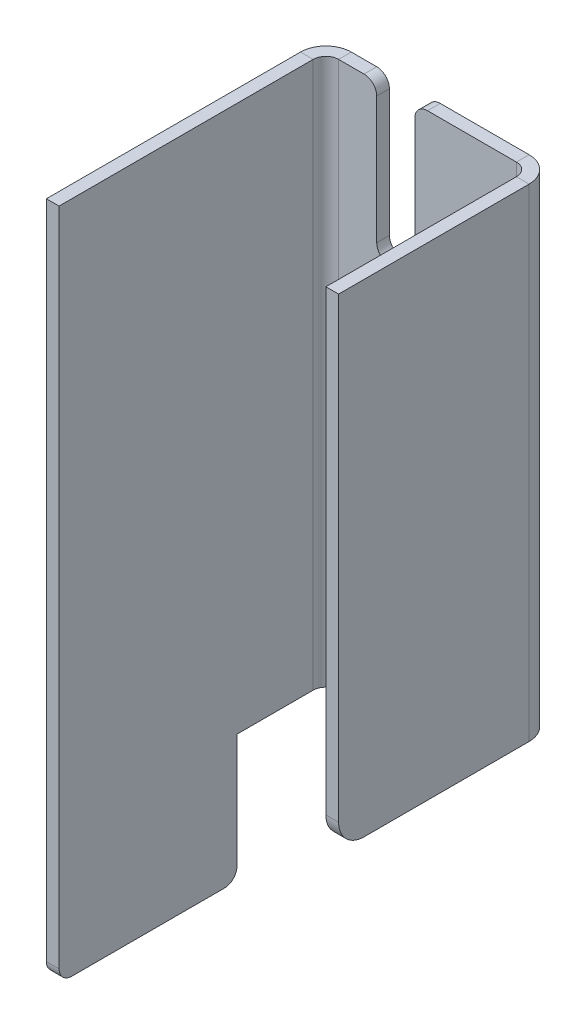
ISO-10303-21;
HEADER;
FILE_DESCRIPTION(('STEP AP214'),'2;1');
FILE_NAME('part.step','',(''),(''),'','','');
FILE_SCHEMA(('AUTOMOTIVE_DESIGN { 1 0 10303 214 1 1 1 1 }'));
ENDSEC;
DATA;
#1=APPLICATION_CONTEXT('core data for automotive mechanical design processes');
#2=APPLICATION_PROTOCOL_DEFINITION('international standard','automotive_design',2000,#1);
#3=PRODUCT_CONTEXT('',#1,'mechanical');
#4=PRODUCT('Part','Part','',(#3));
#5=PRODUCT_RELATED_PRODUCT_CATEGORY('part','',(#4));
#6=PRODUCT_DEFINITION_FORMATION('','',#4);
#7=PRODUCT_DEFINITION_CONTEXT('part definition',#1,'design');
#8=PRODUCT_DEFINITION('design','',#6,#7);
#9=PRODUCT_DEFINITION_SHAPE('','',#8);
#10=(LENGTH_UNIT() NAMED_UNIT(*) SI_UNIT(.MILLI.,.METRE.));
#11=(NAMED_UNIT(*) PLANE_ANGLE_UNIT() SI_UNIT($,.RADIAN.));
#12=(NAMED_UNIT(*) SI_UNIT($,.STERADIAN.) SOLID_ANGLE_UNIT());
#13=UNCERTAINTY_MEASURE_WITH_UNIT(LENGTH_MEASURE(1.E-05),#10,'distance_accuracy_value','');
#14=(GEOMETRIC_REPRESENTATION_CONTEXT(3) GLOBAL_UNCERTAINTY_ASSIGNED_CONTEXT((#13)) GLOBAL_UNIT_ASSIGNED_CONTEXT((#10,
#11,#12)) REPRESENTATION_CONTEXT('',''));
#15=CARTESIAN_POINT('',(0.,0.,0.));
#16=DIRECTION('',(0.,0.,1.));
#17=DIRECTION('',(1.,0.,0.));
#18=AXIS2_PLACEMENT_3D('',#15,#16,#17);
#19=CARTESIAN_POINT('',(6.,5.,-7.));
#20=DIRECTION('',(0.,1.,0.));
#21=DIRECTION('',(0.,0.,1.));
#22=AXIS2_PLACEMENT_3D('',#19,#20,#21);
#23=PLANE('',#22);
#24=DIRECTION('',(0.,0.,1.));
#25=VECTOR('',#24,1.);
#26=CARTESIAN_POINT('',(17.,5.,-22.));
#27=LINE('',#26,#25);
#28=CARTESIAN_POINT('',(17.,5.,-20.));
#29=VERTEX_POINT('',#28);
#30=CARTESIAN_POINT('',(17.,5.,-7.00000000000001));
#31=VERTEX_POINT('',#30);
#32=EDGE_CURVE('E279',#29,#31,#27,.T.);
#33=ORIENTED_EDGE('',*,*,#32,.F.);
#34=DIRECTION('',(1.,0.,0.));
#35=VECTOR('',#34,1.);
#36=CARTESIAN_POINT('',(17.,5.,-20.));
#37=LINE('',#36,#35);
#38=CARTESIAN_POINT('',(18.,5.,-20.));
#39=VERTEX_POINT('',#38);
#40=EDGE_CURVE('E251',#29,#39,#37,.T.);
#41=ORIENTED_EDGE('',*,*,#40,.T.);
#42=DIRECTION('',(0.,0.,1.));
#43=VECTOR('',#42,1.);
#44=CARTESIAN_POINT('',(18.,5.,-7.00000000000001));
#45=LINE('',#44,#43);
#46=CARTESIAN_POINT('',(18.,5.,-7.00000000000001));
#47=VERTEX_POINT('',#46);
#48=EDGE_CURVE('E250',#39,#47,#45,.T.);
#49=ORIENTED_EDGE('',*,*,#48,.T.);
#50=DIRECTION('',(1.,0.,0.));
#51=VECTOR('',#50,1.);
#52=CARTESIAN_POINT('',(6.,5.,-7.));
#53=LINE('',#52,#51);
#54=EDGE_CURVE('E233',#31,#47,#53,.T.);
#55=ORIENTED_EDGE('',*,*,#54,.F.);
#56=EDGE_LOOP('',(#33,#41,#49,#55));
#57=FACE_BOUND('',#56,.T.);
#58=ADVANCED_FACE('F40',(#57),#23,.F.);
#59=DIRECTION('',(1.,0.,0.));
#60=VECTOR('',#59,1.);
#61=CARTESIAN_POINT('',(0.,5.,-21.));
#62=LINE('',#61,#60);
#63=CARTESIAN_POINT('',(7.,5.,-21.));
#64=VERTEX_POINT('',#63);
#65=CARTESIAN_POINT('',(16.,5.,-21.));
#66=VERTEX_POINT('',#65);
#67=EDGE_CURVE('E272',#64,#66,#62,.T.);
#68=ORIENTED_EDGE('',*,*,#67,.F.);
#69=DIRECTION('',(0.,0.,1.));
#70=VECTOR('',#69,1.);
#71=CARTESIAN_POINT('',(7.,5.,-22.));
#72=LINE('',#71,#70);
#73=CARTESIAN_POINT('',(7.,5.,-22.));
#74=VERTEX_POINT('',#73);
#75=EDGE_CURVE('E501',#64,#74,#72,.F.);
#76=ORIENTED_EDGE('',*,*,#75,.T.);
#77=DIRECTION('',(1.,0.,0.));
#78=VECTOR('',#77,1.);
#79=CARTESIAN_POINT('',(5.99999999999999,5.,-22.));
#80=LINE('',#79,#78);
#81=CARTESIAN_POINT('',(16.,5.,-22.));
#82=VERTEX_POINT('',#81);
#83=EDGE_CURVE('E247',#74,#82,#80,.T.);
#84=ORIENTED_EDGE('',*,*,#83,.T.);
#85=DIRECTION('',(0.,0.,1.));
#86=VECTOR('',#85,1.);
#87=CARTESIAN_POINT('',(16.,5.,-22.));
#88=LINE('',#87,#86);
#89=EDGE_CURVE('E466',#82,#66,#88,.T.);
#90=ORIENTED_EDGE('',*,*,#89,.T.);
#91=EDGE_LOOP('',(#68,#76,#84,#90));
#92=FACE_BOUND('',#91,.T.);
#93=ADVANCED_FACE('F634',(#92),#23,.F.);
#94=CARTESIAN_POINT('',(1.,43.,-20.));
#95=DIRECTION('',(0.,1.,0.));
#96=DIRECTION('',(0.,0.,1.));
#97=AXIS2_PLACEMENT_3D('',#94,#95,#96);
#98=PLANE('',#97);
#99=DIRECTION('',(1.,0.,0.));
#100=VECTOR('',#99,1.);
#101=CARTESIAN_POINT('',(0.,43.,-21.));
#102=LINE('',#101,#100);
#103=CARTESIAN_POINT('',(2.,43.,-21.));
#104=VERTEX_POINT('',#103);
#105=CARTESIAN_POINT('',(4.,43.,-21.));
#106=VERTEX_POINT('',#105);
#107=EDGE_CURVE('E373',#104,#106,#102,.T.);
#108=ORIENTED_EDGE('',*,*,#107,.T.);
#109=DIRECTION('',(0.,0.,-1.));
#110=VECTOR('',#109,1.);
#111=CARTESIAN_POINT('',(4.,43.,-22.));
#112=LINE('',#111,#110);
#113=CARTESIAN_POINT('',(4.,43.,-22.));
#114=VERTEX_POINT('',#113);
#115=EDGE_CURVE('E552',#106,#114,#112,.T.);
#116=ORIENTED_EDGE('',*,*,#115,.T.);
#117=DIRECTION('',(1.,0.,0.));
#118=VECTOR('',#117,1.);
#119=CARTESIAN_POINT('',(0.,43.,-22.));
#120=LINE('',#119,#118);
#121=CARTESIAN_POINT('',(2.,43.,-22.));
#122=VERTEX_POINT('',#121);
#123=EDGE_CURVE('E348',#122,#114,#120,.T.);
#124=ORIENTED_EDGE('',*,*,#123,.F.);
#125=DIRECTION('',(0.,0.,1.));
#126=VECTOR('',#125,1.);
#127=CARTESIAN_POINT('',(2.,43.,-22.));
#128=LINE('',#127,#126);
#129=EDGE_CURVE('E455',#122,#104,#128,.T.);
#130=ORIENTED_EDGE('',*,*,#129,.T.);
#131=EDGE_LOOP('',(#108,#116,#124,#130));
#132=FACE_BOUND('',#131,.T.);
#133=ADVANCED_FACE('F602',(#132),#98,.T.);
#134=CARTESIAN_POINT('',(2.,43.,-22.));
#135=DIRECTION('',(0.,1.,0.));
#136=DIRECTION('',(0.,0.,1.));
#137=AXIS2_PLACEMENT_3D('',#134,#135,#136);
#138=PLANE('',#137);
#139=ORIENTED_EDGE('',*,*,#129,.F.);
#140=CARTESIAN_POINT('',(2.,43.,-20.));
#141=DIRECTION('',(0.,1.,0.));
#142=DIRECTION('',(0.,0.,1.));
#143=AXIS2_PLACEMENT_3D('',#140,#141,#142);
#144=CIRCLE('',#143,2.);
#145=CARTESIAN_POINT('',(0.,43.,-20.));
#146=VERTEX_POINT('',#145);
#147=EDGE_CURVE('E352',#146,#122,#144,.F.);
#148=ORIENTED_EDGE('',*,*,#147,.F.);
#149=DIRECTION('',(-1.,0.,0.));
#150=VECTOR('',#149,1.);
#151=CARTESIAN_POINT('',(1.,43.,-20.));
#152=LINE('',#151,#150);
#153=CARTESIAN_POINT('',(1.,43.,-20.));
#154=VERTEX_POINT('',#153);
#155=EDGE_CURVE('E452',#154,#146,#152,.T.);
#156=ORIENTED_EDGE('',*,*,#155,.F.);
#157=CARTESIAN_POINT('',(2.,43.,-20.));
#158=DIRECTION('',(0.,1.,0.));
#159=DIRECTION('',(1.,0.,0.));
#160=AXIS2_PLACEMENT_3D('',#157,#158,#159);
#161=CIRCLE('',#160,1.);
#162=EDGE_CURVE('E368',#154,#104,#161,.F.);
#163=ORIENTED_EDGE('',*,*,#162,.T.);
#164=EDGE_LOOP('',(#139,#148,#156,#163));
#165=FACE_BOUND('',#164,.T.);
#166=ADVANCED_FACE('F609',(#165),#138,.T.);
#167=CARTESIAN_POINT('',(9.,43.,-22.));
#168=VERTEX_POINT('',#167);
#169=CARTESIAN_POINT('',(16.,43.,-22.));
#170=VERTEX_POINT('',#169);
#171=EDGE_CURVE('E347',#168,#170,#120,.T.);
#172=ORIENTED_EDGE('',*,*,#171,.F.);
#173=DIRECTION('',(0.,0.,-1.));
#174=VECTOR('',#173,1.);
#175=CARTESIAN_POINT('',(9.,43.,-21.));
#176=LINE('',#175,#174);
#177=CARTESIAN_POINT('',(9.,43.,-21.));
#178=VERTEX_POINT('',#177);
#179=EDGE_CURVE('E549',#168,#178,#176,.F.);
#180=ORIENTED_EDGE('',*,*,#179,.T.);
#181=CARTESIAN_POINT('',(16.,43.,-21.));
#182=VERTEX_POINT('',#181);
#183=EDGE_CURVE('E372',#178,#182,#102,.T.);
#184=ORIENTED_EDGE('',*,*,#183,.T.);
#185=DIRECTION('',(0.,0.,-1.));
#186=VECTOR('',#185,1.);
#187=CARTESIAN_POINT('',(16.,43.,-21.));
#188=LINE('',#187,#186);
#189=EDGE_CURVE('E438',#182,#170,#188,.T.);
#190=ORIENTED_EDGE('',*,*,#189,.T.);
#191=EDGE_LOOP('',(#172,#180,#184,#190));
#192=FACE_BOUND('',#191,.T.);
#193=ADVANCED_FACE('F654',(#192),#98,.T.);
#194=CARTESIAN_POINT('',(0.,0.,-20.));
#195=DIRECTION('',(0.,-1.,0.));
#196=DIRECTION('',(0.,0.,-1.));
#197=AXIS2_PLACEMENT_3D('',#194,#195,#196);
#198=PLANE('',#197);
#199=DIRECTION('',(1.,0.,0.));
#200=VECTOR('',#199,1.);
#201=CARTESIAN_POINT('',(0.,0.,-20.));
#202=LINE('',#201,#200);
#203=CARTESIAN_POINT('',(0.,0.,-20.));
#204=VERTEX_POINT('',#203);
#205=CARTESIAN_POINT('',(1.,0.,-20.));
#206=VERTEX_POINT('',#205);
#207=EDGE_CURVE('E448',#204,#206,#202,.T.);
#208=ORIENTED_EDGE('',*,*,#207,.F.);
#209=CARTESIAN_POINT('',(2.,0.,-20.));
#210=DIRECTION('',(0.,1.,0.));
#211=DIRECTION('',(0.,0.,1.));
#212=AXIS2_PLACEMENT_3D('',#209,#210,#211);
#213=CIRCLE('',#212,2.);
#214=CARTESIAN_POINT('',(2.,0.,-22.));
#215=VERTEX_POINT('',#214);
#216=EDGE_CURVE('E385',#204,#215,#213,.F.);
#217=ORIENTED_EDGE('',*,*,#216,.T.);
#218=DIRECTION('',(0.,0.,-1.));
#219=VECTOR('',#218,1.);
#220=CARTESIAN_POINT('',(2.,0.,-21.));
#221=LINE('',#220,#219);
#222=CARTESIAN_POINT('',(2.,0.,-21.));
#223=VERTEX_POINT('',#222);
#224=EDGE_CURVE('E445',#223,#215,#221,.T.);
#225=ORIENTED_EDGE('',*,*,#224,.F.);
#226=CARTESIAN_POINT('',(2.,0.,-20.));
#227=DIRECTION('',(0.,1.,0.));
#228=DIRECTION('',(1.,0.,0.));
#229=AXIS2_PLACEMENT_3D('',#226,#227,#228);
#230=CIRCLE('',#229,1.);
#231=EDGE_CURVE('E395',#206,#223,#230,.F.);
#232=ORIENTED_EDGE('',*,*,#231,.F.);
#233=EDGE_LOOP('',(#208,#217,#225,#232));
#234=FACE_BOUND('',#233,.T.);
#235=ADVANCED_FACE('F795',(#234),#198,.T.);
#236=CARTESIAN_POINT('',(2.,0.,-21.));
#237=DIRECTION('',(0.,-1.,0.));
#238=DIRECTION('',(0.,0.,-1.));
#239=AXIS2_PLACEMENT_3D('',#236,#237,#238);
#240=PLANE('',#239);
#241=DIRECTION('',(-1.,0.,0.));
#242=VECTOR('',#241,1.);
#243=CARTESIAN_POINT('',(1.,0.,-14.));
#244=LINE('',#243,#242);
#245=CARTESIAN_POINT('',(1.,0.,-14.));
#246=VERTEX_POINT('',#245);
#247=CARTESIAN_POINT('',(0.,0.,-14.));
#248=VERTEX_POINT('',#247);
#249=EDGE_CURVE('E324',#246,#248,#244,.T.);
#250=ORIENTED_EDGE('',*,*,#249,.T.);
#251=DIRECTION('',(0.,0.,-1.));
#252=VECTOR('',#251,1.);
#253=CARTESIAN_POINT('',(0.,0.,0.));
#254=LINE('',#253,#252);
#255=EDGE_CURVE('E389',#248,#204,#254,.T.);
#256=ORIENTED_EDGE('',*,*,#255,.T.);
#257=ORIENTED_EDGE('',*,*,#207,.T.);
#258=DIRECTION('',(0.,0.,-1.));
#259=VECTOR('',#258,1.);
#260=CARTESIAN_POINT('',(1.,0.,0.));
#261=LINE('',#260,#259);
#262=EDGE_CURVE('E392',#246,#206,#261,.T.);
#263=ORIENTED_EDGE('',*,*,#262,.F.);
#264=EDGE_LOOP('',(#250,#256,#257,#263));
#265=FACE_BOUND('',#264,.T.);
#266=ADVANCED_FACE('F919',(#265),#240,.T.);
#267=CARTESIAN_POINT('',(18.,43.,-20.));
#268=DIRECTION('',(0.,1.,0.));
#269=DIRECTION('',(0.,0.,1.));
#270=AXIS2_PLACEMENT_3D('',#267,#268,#269);
#271=PLANE('',#270);
#272=DIRECTION('',(-1.,0.,0.));
#273=VECTOR('',#272,1.);
#274=CARTESIAN_POINT('',(18.,43.,-20.));
#275=LINE('',#274,#273);
#276=CARTESIAN_POINT('',(18.,43.,-20.));
#277=VERTEX_POINT('',#276);
#278=CARTESIAN_POINT('',(17.,43.,-20.));
#279=VERTEX_POINT('',#278);
#280=EDGE_CURVE('E442',#277,#279,#275,.T.);
#281=ORIENTED_EDGE('',*,*,#280,.F.);
#282=CARTESIAN_POINT('',(16.,43.,-20.));
#283=DIRECTION('',(0.,1.,0.));
#284=DIRECTION('',(0.,0.,1.));
#285=AXIS2_PLACEMENT_3D('',#282,#283,#284);
#286=CIRCLE('',#285,2.);
#287=EDGE_CURVE('E343',#170,#277,#286,.F.);
#288=ORIENTED_EDGE('',*,*,#287,.F.);
#289=ORIENTED_EDGE('',*,*,#189,.F.);
#290=CARTESIAN_POINT('',(16.,43.,-20.));
#291=DIRECTION('',(0.,1.,0.));
#292=DIRECTION('',(1.,0.,0.));
#293=AXIS2_PLACEMENT_3D('',#290,#291,#292);
#294=CIRCLE('',#293,1.);
#295=EDGE_CURVE('E377',#182,#279,#294,.F.);
#296=ORIENTED_EDGE('',*,*,#295,.T.);
#297=EDGE_LOOP('',(#281,#288,#289,#296));
#298=FACE_BOUND('',#297,.T.);
#299=ADVANCED_FACE('F662',(#298),#271,.T.);
#300=CARTESIAN_POINT('',(16.,43.,-21.));
#301=DIRECTION('',(0.,1.,0.));
#302=DIRECTION('',(0.,0.,1.));
#303=AXIS2_PLACEMENT_3D('',#300,#301,#302);
#304=PLANE('',#303);
#305=DIRECTION('',(1.,0.,0.));
#306=VECTOR('',#305,1.);
#307=CARTESIAN_POINT('',(6.,43.,-4.99999999999999));
#308=LINE('',#307,#306);
#309=CARTESIAN_POINT('',(17.,43.,-4.99999999999999));
#310=VERTEX_POINT('',#309);
#311=CARTESIAN_POINT('',(18.,43.,-4.99999999999999));
#312=VERTEX_POINT('',#311);
#313=EDGE_CURVE('E268',#310,#312,#308,.T.);
#314=ORIENTED_EDGE('',*,*,#313,.T.);
#315=DIRECTION('',(0.,0.,1.));
#316=VECTOR('',#315,1.);
#317=CARTESIAN_POINT('',(18.,43.,-22.));
#318=LINE('',#317,#316);
#319=EDGE_CURVE('E339',#277,#312,#318,.T.);
#320=ORIENTED_EDGE('',*,*,#319,.F.);
#321=ORIENTED_EDGE('',*,*,#280,.T.);
#322=DIRECTION('',(0.,0.,1.));
#323=VECTOR('',#322,1.);
#324=CARTESIAN_POINT('',(17.,43.,-22.));
#325=LINE('',#324,#323);
#326=EDGE_CURVE('E335',#279,#310,#325,.T.);
#327=ORIENTED_EDGE('',*,*,#326,.T.);
#328=EDGE_LOOP('',(#314,#320,#321,#327));
#329=FACE_BOUND('',#328,.T.);
#330=ADVANCED_FACE('F665',(#329),#304,.T.);
#331=CARTESIAN_POINT('',(17.,0.,-20.));
#332=DIRECTION('',(0.,-1.,0.));
#333=DIRECTION('',(0.,0.,-1.));
#334=AXIS2_PLACEMENT_3D('',#331,#332,#333);
#335=PLANE('',#334);
#336=DIRECTION('',(1.,0.,0.));
#337=VECTOR('',#336,1.);
#338=CARTESIAN_POINT('',(0.,0.,-22.));
#339=LINE('',#338,#337);
#340=CARTESIAN_POINT('',(5.,0.,-22.));
#341=VERTEX_POINT('',#340);
#342=EDGE_CURVE('E334',#215,#341,#339,.T.);
#343=ORIENTED_EDGE('',*,*,#342,.T.);
#344=DIRECTION('',(0.,0.,-1.));
#345=VECTOR('',#344,1.);
#346=CARTESIAN_POINT('',(5.,0.,-21.));
#347=LINE('',#346,#345);
#348=CARTESIAN_POINT('',(5.,0.,-21.));
#349=VERTEX_POINT('',#348);
#350=EDGE_CURVE('E489',#341,#349,#347,.F.);
#351=ORIENTED_EDGE('',*,*,#350,.T.);
#352=DIRECTION('',(1.,0.,0.));
#353=VECTOR('',#352,1.);
#354=CARTESIAN_POINT('',(0.,0.,-21.));
#355=LINE('',#354,#353);
#356=EDGE_CURVE('E340',#223,#349,#355,.T.);
#357=ORIENTED_EDGE('',*,*,#356,.F.);
#358=ORIENTED_EDGE('',*,*,#224,.T.);
#359=EDGE_LOOP('',(#343,#351,#357,#358));
#360=FACE_BOUND('',#359,.T.);
#361=ADVANCED_FACE('F616',(#360),#335,.T.);
#362=CARTESIAN_POINT('',(17.,43.,-22.));
#363=DIRECTION('',(1.,0.,0.));
#364=DIRECTION('',(0.,0.,-1.));
#365=AXIS2_PLACEMENT_3D('',#362,#363,#364);
#366=PLANE('',#365);
#367=CARTESIAN_POINT('',(17.,7.,-7.00000000000001));
#368=DIRECTION('',(1.,0.,0.));
#369=DIRECTION('',(0.,0.,-1.));
#370=AXIS2_PLACEMENT_3D('',#367,#368,#369);
#371=CIRCLE('',#370,2.);
#372=CARTESIAN_POINT('',(17.,7.,-5.00000000000001));
#373=VERTEX_POINT('',#372);
#374=EDGE_CURVE('E241',#31,#373,#371,.F.);
#375=ORIENTED_EDGE('',*,*,#374,.T.);
#376=DIRECTION('',(0.,1.,0.));
#377=VECTOR('',#376,1.);
#378=CARTESIAN_POINT('',(17.,43.,-4.99999999999999));
#379=LINE('',#378,#377);
#380=EDGE_CURVE('E287',#373,#310,#379,.T.);
#381=ORIENTED_EDGE('',*,*,#380,.T.);
#382=ORIENTED_EDGE('',*,*,#326,.F.);
#383=DIRECTION('',(0.,-1.,0.));
#384=VECTOR('',#383,1.);
#385=CARTESIAN_POINT('',(17.,43.,-20.));
#386=LINE('',#385,#384);
#387=EDGE_CURVE('E381',#279,#29,#386,.T.);
#388=ORIENTED_EDGE('',*,*,#387,.T.);
#389=ORIENTED_EDGE('',*,*,#32,.T.);
#390=EDGE_LOOP('',(#375,#381,#382,#388,#389));
#391=FACE_BOUND('',#390,.T.);
#392=ADVANCED_FACE('F670',(#391),#366,.F.);
#393=CARTESIAN_POINT('',(18.,43.,-22.));
#394=DIRECTION('',(1.,0.,0.));
#395=DIRECTION('',(0.,0.,-1.));
#396=AXIS2_PLACEMENT_3D('',#393,#394,#395);
#397=PLANE('',#396);
#398=DIRECTION('',(0.,1.,0.));
#399=VECTOR('',#398,1.);
#400=CARTESIAN_POINT('',(18.,43.,-4.99999999999999));
#401=LINE('',#400,#399);
#402=CARTESIAN_POINT('',(18.,7.,-5.00000000000001));
#403=VERTEX_POINT('',#402);
#404=EDGE_CURVE('E260',#403,#312,#401,.T.);
#405=ORIENTED_EDGE('',*,*,#404,.F.);
#406=CARTESIAN_POINT('',(18.,7.,-7.00000000000001));
#407=DIRECTION('',(-1.,0.,0.));
#408=DIRECTION('',(0.,0.,1.));
#409=AXIS2_PLACEMENT_3D('',#406,#407,#408);
#410=CIRCLE('',#409,2.);
#411=EDGE_CURVE('E238',#47,#403,#410,.T.);
#412=ORIENTED_EDGE('',*,*,#411,.F.);
#413=ORIENTED_EDGE('',*,*,#48,.F.);
#414=DIRECTION('',(0.,-1.,0.));
#415=VECTOR('',#414,1.);
#416=CARTESIAN_POINT('',(18.,43.,-20.));
#417=LINE('',#416,#415);
#418=EDGE_CURVE('E435',#277,#39,#417,.T.);
#419=ORIENTED_EDGE('',*,*,#418,.F.);
#420=ORIENTED_EDGE('',*,*,#319,.T.);
#421=EDGE_LOOP('',(#405,#412,#413,#419,#420));
#422=FACE_BOUND('',#421,.T.);
#423=ADVANCED_FACE('F258',(#422),#397,.T.);
#424=CARTESIAN_POINT('',(16.,43.,-20.));
#425=DIRECTION('',(0.,-1.,0.));
#426=DIRECTION('',(0.,0.,-1.));
#427=AXIS2_PLACEMENT_3D('',#424,#425,#426);
#428=CYLINDRICAL_SURFACE('',#427,2.);
#429=CARTESIAN_POINT('',(16.,5.,-20.));
#430=DIRECTION('',(0.,1.,0.));
#431=DIRECTION('',(0.,0.,1.));
#432=AXIS2_PLACEMENT_3D('',#429,#430,#431);
#433=CIRCLE('',#432,2.);
#434=EDGE_CURVE('E282',#82,#39,#433,.F.);
#435=ORIENTED_EDGE('',*,*,#434,.F.);
#436=DIRECTION('',(0.,-1.,0.));
#437=VECTOR('',#436,1.);
#438=CARTESIAN_POINT('',(16.,43.,-22.));
#439=LINE('',#438,#437);
#440=EDGE_CURVE('E431',#170,#82,#439,.T.);
#441=ORIENTED_EDGE('',*,*,#440,.F.);
#442=ORIENTED_EDGE('',*,*,#287,.T.);
#443=ORIENTED_EDGE('',*,*,#418,.T.);
#444=EDGE_LOOP('',(#435,#441,#442,#443));
#445=FACE_BOUND('',#444,.T.);
#446=ADVANCED_FACE('F661',(#445),#428,.T.);
#447=CARTESIAN_POINT('',(0.,43.,-22.));
#448=DIRECTION('',(0.,0.,-1.));
#449=DIRECTION('',(-1.,0.,0.));
#450=AXIS2_PLACEMENT_3D('',#447,#448,#449);
#451=PLANE('',#450);
#452=DIRECTION('',(0.,1.,0.));
#453=VECTOR('',#452,1.);
#454=CARTESIAN_POINT('',(5.99999999999999,5.,-22.));
#455=LINE('',#454,#453);
#456=CARTESIAN_POINT('',(5.99999999999999,1.,-22.));
#457=VERTEX_POINT('',#456);
#458=CARTESIAN_POINT('',(5.99999999999999,4.,-22.));
#459=VERTEX_POINT('',#458);
#460=EDGE_CURVE('E264',#457,#459,#455,.T.);
#461=ORIENTED_EDGE('',*,*,#460,.F.);
#462=CARTESIAN_POINT('',(5.,1.,-22.));
#463=DIRECTION('',(0.,0.,-1.));
#464=DIRECTION('',(-1.,0.,0.));
#465=AXIS2_PLACEMENT_3D('',#462,#463,#464);
#466=CIRCLE('',#465,1.);
#467=EDGE_CURVE('E486',#457,#341,#466,.T.);
#468=ORIENTED_EDGE('',*,*,#467,.T.);
#469=ORIENTED_EDGE('',*,*,#342,.F.);
#470=DIRECTION('',(0.,-1.,0.));
#471=VECTOR('',#470,1.);
#472=CARTESIAN_POINT('',(2.,43.,-22.));
#473=LINE('',#472,#471);
#474=EDGE_CURVE('E427',#122,#215,#473,.T.);
#475=ORIENTED_EDGE('',*,*,#474,.F.);
#476=ORIENTED_EDGE('',*,*,#123,.T.);
#477=CARTESIAN_POINT('',(4.,42.,-22.));
#478=DIRECTION('',(0.,0.,-1.));
#479=DIRECTION('',(-1.,0.,0.));
#480=AXIS2_PLACEMENT_3D('',#477,#478,#479);
#481=CIRCLE('',#480,1.);
#482=CARTESIAN_POINT('',(5.,42.,-22.));
#483=VERTEX_POINT('',#482);
#484=EDGE_CURVE('E480',#114,#483,#481,.T.);
#485=ORIENTED_EDGE('',*,*,#484,.T.);
#486=DIRECTION('',(0.,1.,0.));
#487=VECTOR('',#486,1.);
#488=CARTESIAN_POINT('',(5.,43.,-22.));
#489=LINE('',#488,#487);
#490=CARTESIAN_POINT('',(5.,32.,-22.));
#491=VERTEX_POINT('',#490);
#492=EDGE_CURVE('E291',#491,#483,#489,.T.);
#493=ORIENTED_EDGE('',*,*,#492,.F.);
#494=CARTESIAN_POINT('',(6.,32.,-22.));
#495=DIRECTION('',(0.,0.,-1.));
#496=DIRECTION('',(-1.,0.,0.));
#497=AXIS2_PLACEMENT_3D('',#494,#495,#496);
#498=CIRCLE('',#497,1.);
#499=CARTESIAN_POINT('',(6.,31.,-22.));
#500=VERTEX_POINT('',#499);
#501=EDGE_CURVE('E562',#491,#500,#498,.F.);
#502=ORIENTED_EDGE('',*,*,#501,.T.);
#503=DIRECTION('',(-1.,0.,0.));
#504=VECTOR('',#503,1.);
#505=CARTESIAN_POINT('',(5.,31.,-22.));
#506=LINE('',#505,#504);
#507=CARTESIAN_POINT('',(7.,31.,-22.));
#508=VERTEX_POINT('',#507);
#509=EDGE_CURVE('E297',#508,#500,#506,.T.);
#510=ORIENTED_EDGE('',*,*,#509,.F.);
#511=CARTESIAN_POINT('',(7.,32.,-22.));
#512=DIRECTION('',(0.,0.,-1.));
#513=DIRECTION('',(-1.,0.,0.));
#514=AXIS2_PLACEMENT_3D('',#511,#512,#513);
#515=CIRCLE('',#514,1.);
#516=CARTESIAN_POINT('',(8.,32.,-22.));
#517=VERTEX_POINT('',#516);
#518=EDGE_CURVE('E49',#508,#517,#515,.F.);
#519=ORIENTED_EDGE('',*,*,#518,.T.);
#520=DIRECTION('',(0.,-1.,0.));
#521=VECTOR('',#520,1.);
#522=CARTESIAN_POINT('',(8.,43.,-22.));
#523=LINE('',#522,#521);
#524=CARTESIAN_POINT('',(8.,42.,-22.));
#525=VERTEX_POINT('',#524);
#526=EDGE_CURVE('E309',#525,#517,#523,.T.);
#527=ORIENTED_EDGE('',*,*,#526,.F.);
#528=CARTESIAN_POINT('',(9.,42.,-22.));
#529=DIRECTION('',(0.,0.,-1.));
#530=DIRECTION('',(-1.,0.,0.));
#531=AXIS2_PLACEMENT_3D('',#528,#529,#530);
#532=CIRCLE('',#531,1.);
#533=EDGE_CURVE('E483',#525,#168,#532,.T.);
#534=ORIENTED_EDGE('',*,*,#533,.T.);
#535=ORIENTED_EDGE('',*,*,#171,.T.);
#536=ORIENTED_EDGE('',*,*,#440,.T.);
#537=ORIENTED_EDGE('',*,*,#83,.F.);
#538=CARTESIAN_POINT('',(7.,4.,-22.));
#539=DIRECTION('',(0.,0.,-1.));
#540=DIRECTION('',(-1.,0.,0.));
#541=AXIS2_PLACEMENT_3D('',#538,#539,#540);
#542=CIRCLE('',#541,1.);
#543=EDGE_CURVE('E559',#74,#459,#542,.F.);
#544=ORIENTED_EDGE('',*,*,#543,.T.);
#545=EDGE_LOOP('',(#461,#468,#469,#475,#476,#485,#493,#502,#510,#519,#527,#534,#535,#536,#537,#544));
#546=FACE_BOUND('',#545,.T.);
#547=ADVANCED_FACE('F572',(#546),#451,.T.);
#548=CARTESIAN_POINT('',(2.,43.,-20.));
#549=DIRECTION('',(0.,-1.,0.));
#550=DIRECTION('',(0.,0.,-1.));
#551=AXIS2_PLACEMENT_3D('',#548,#549,#550);
#552=CYLINDRICAL_SURFACE('',#551,2.);
#553=ORIENTED_EDGE('',*,*,#216,.F.);
#554=DIRECTION('',(0.,-1.,0.));
#555=VECTOR('',#554,1.);
#556=CARTESIAN_POINT('',(0.,43.,-20.));
#557=LINE('',#556,#555);
#558=EDGE_CURVE('E423',#146,#204,#557,.T.);
#559=ORIENTED_EDGE('',*,*,#558,.F.);
#560=ORIENTED_EDGE('',*,*,#147,.T.);
#561=ORIENTED_EDGE('',*,*,#474,.T.);
#562=EDGE_LOOP('',(#553,#559,#560,#561));
#563=FACE_BOUND('',#562,.T.);
#564=ADVANCED_FACE('F737',(#563),#552,.T.);
#565=CARTESIAN_POINT('',(0.,43.,0.));
#566=DIRECTION('',(-1.,0.,0.));
#567=DIRECTION('',(0.,0.,1.));
#568=AXIS2_PLACEMENT_3D('',#565,#566,#567);
#569=PLANE('',#568);
#570=DIRECTION('',(0.,0.,1.));
#571=VECTOR('',#570,1.);
#572=CARTESIAN_POINT('',(0.,-10.,0.));
#573=LINE('',#572,#571);
#574=CARTESIAN_POINT('',(0.,-10.,-13.));
#575=VERTEX_POINT('',#574);
#576=CARTESIAN_POINT('',(0.,-10.,-0.999999999999999));
#577=VERTEX_POINT('',#576);
#578=EDGE_CURVE('E320',#575,#577,#573,.T.);
#579=ORIENTED_EDGE('',*,*,#578,.T.);
#580=CARTESIAN_POINT('',(0.,-9.,-1.));
#581=DIRECTION('',(-1.,0.,0.));
#582=DIRECTION('',(0.,0.,1.));
#583=AXIS2_PLACEMENT_3D('',#580,#581,#582);
#584=CIRCLE('',#583,1.);
#585=CARTESIAN_POINT('',(0.,-9.,0.));
#586=VERTEX_POINT('',#585);
#587=EDGE_CURVE('E514',#577,#586,#584,.T.);
#588=ORIENTED_EDGE('',*,*,#587,.T.);
#589=DIRECTION('',(0.,-1.,0.));
#590=VECTOR('',#589,1.);
#591=CARTESIAN_POINT('',(0.,43.,0.));
#592=LINE('',#591,#590);
#593=CARTESIAN_POINT('',(0.,43.,0.));
#594=VERTEX_POINT('',#593);
#595=EDGE_CURVE('E420',#594,#586,#592,.T.);
#596=ORIENTED_EDGE('',*,*,#595,.F.);
#597=DIRECTION('',(0.,0.,-1.));
#598=VECTOR('',#597,1.);
#599=CARTESIAN_POINT('',(0.,43.,0.));
#600=LINE('',#599,#598);
#601=EDGE_CURVE('E356',#594,#146,#600,.T.);
#602=ORIENTED_EDGE('',*,*,#601,.T.);
#603=ORIENTED_EDGE('',*,*,#558,.T.);
#604=ORIENTED_EDGE('',*,*,#255,.F.);
#605=DIRECTION('',(0.,-1.,0.));
#606=VECTOR('',#605,1.);
#607=CARTESIAN_POINT('',(0.,0.,-14.));
#608=LINE('',#607,#606);
#609=CARTESIAN_POINT('',(0.,-9.,-14.));
#610=VERTEX_POINT('',#609);
#611=EDGE_CURVE('E305',#248,#610,#608,.T.);
#612=ORIENTED_EDGE('',*,*,#611,.T.);
#613=CARTESIAN_POINT('',(0.,-9.,-13.));
#614=DIRECTION('',(-1.,0.,0.));
#615=DIRECTION('',(0.,0.,1.));
#616=AXIS2_PLACEMENT_3D('',#613,#614,#615);
#617=CIRCLE('',#616,1.);
#618=EDGE_CURVE('E511',#610,#575,#617,.T.);
#619=ORIENTED_EDGE('',*,*,#618,.T.);
#620=EDGE_LOOP('',(#579,#588,#596,#602,#603,#604,#612,#619));
#621=FACE_BOUND('',#620,.T.);
#622=ADVANCED_FACE('F734',(#621),#569,.T.);
#623=CARTESIAN_POINT('',(1.,43.,0.));
#624=DIRECTION('',(0.,0.,1.));
#625=DIRECTION('',(1.,0.,0.));
#626=AXIS2_PLACEMENT_3D('',#623,#624,#625);
#627=PLANE('',#626);
#628=ORIENTED_EDGE('',*,*,#595,.T.);
#629=DIRECTION('',(-1.,0.,0.));
#630=VECTOR('',#629,1.);
#631=CARTESIAN_POINT('',(1.,-9.,0.));
#632=LINE('',#631,#630);
#633=CARTESIAN_POINT('',(1.,-9.,0.));
#634=VERTEX_POINT('',#633);
#635=EDGE_CURVE('E64',#586,#634,#632,.F.);
#636=ORIENTED_EDGE('',*,*,#635,.T.);
#637=DIRECTION('',(0.,-1.,0.));
#638=VECTOR('',#637,1.);
#639=CARTESIAN_POINT('',(1.,43.,0.));
#640=LINE('',#639,#638);
#641=CARTESIAN_POINT('',(1.,43.,0.));
#642=VERTEX_POINT('',#641);
#643=EDGE_CURVE('E417',#642,#634,#640,.T.);
#644=ORIENTED_EDGE('',*,*,#643,.F.);
#645=DIRECTION('',(-1.,0.,0.));
#646=VECTOR('',#645,1.);
#647=CARTESIAN_POINT('',(1.,43.,0.));
#648=LINE('',#647,#646);
#649=EDGE_CURVE('E360',#642,#594,#648,.T.);
#650=ORIENTED_EDGE('',*,*,#649,.T.);
#651=EDGE_LOOP('',(#628,#636,#644,#650));
#652=FACE_BOUND('',#651,.T.);
#653=ADVANCED_FACE('F731',(#652),#627,.T.);
#654=CARTESIAN_POINT('',(1.,43.,0.));
#655=DIRECTION('',(-1.,0.,0.));
#656=DIRECTION('',(0.,0.,1.));
#657=AXIS2_PLACEMENT_3D('',#654,#655,#656);
#658=PLANE('',#657);
#659=ORIENTED_EDGE('',*,*,#643,.T.);
#660=CARTESIAN_POINT('',(1.,-9.,-1.));
#661=DIRECTION('',(-1.,0.,0.));
#662=DIRECTION('',(0.,0.,1.));
#663=AXIS2_PLACEMENT_3D('',#660,#661,#662);
#664=CIRCLE('',#663,1.);
#665=CARTESIAN_POINT('',(1.,-10.,-0.999999999999999));
#666=VERTEX_POINT('',#665);
#667=EDGE_CURVE('E521',#634,#666,#664,.F.);
#668=ORIENTED_EDGE('',*,*,#667,.T.);
#669=DIRECTION('',(0.,0.,1.));
#670=VECTOR('',#669,1.);
#671=CARTESIAN_POINT('',(1.,-10.,0.));
#672=LINE('',#671,#670);
#673=CARTESIAN_POINT('',(1.,-10.,-13.));
#674=VERTEX_POINT('',#673);
#675=EDGE_CURVE('E319',#674,#666,#672,.T.);
#676=ORIENTED_EDGE('',*,*,#675,.F.);
#677=CARTESIAN_POINT('',(1.,-9.,-13.));
#678=DIRECTION('',(-1.,0.,0.));
#679=DIRECTION('',(0.,0.,1.));
#680=AXIS2_PLACEMENT_3D('',#677,#678,#679);
#681=CIRCLE('',#680,1.);
#682=CARTESIAN_POINT('',(1.,-9.,-14.));
#683=VERTEX_POINT('',#682);
#684=EDGE_CURVE('E56',#674,#683,#681,.F.);
#685=ORIENTED_EDGE('',*,*,#684,.T.);
#686=DIRECTION('',(0.,-1.,0.));
#687=VECTOR('',#686,1.);
#688=CARTESIAN_POINT('',(1.,0.,-14.));
#689=LINE('',#688,#687);
#690=EDGE_CURVE('E316',#246,#683,#689,.T.);
#691=ORIENTED_EDGE('',*,*,#690,.F.);
#692=ORIENTED_EDGE('',*,*,#262,.T.);
#693=DIRECTION('',(0.,-1.,0.));
#694=VECTOR('',#693,1.);
#695=CARTESIAN_POINT('',(1.,43.,-20.));
#696=LINE('',#695,#694);
#697=EDGE_CURVE('E413',#154,#206,#696,.T.);
#698=ORIENTED_EDGE('',*,*,#697,.F.);
#699=DIRECTION('',(0.,0.,-1.));
#700=VECTOR('',#699,1.);
#701=CARTESIAN_POINT('',(1.,43.,0.));
#702=LINE('',#701,#700);
#703=EDGE_CURVE('E364',#642,#154,#702,.T.);
#704=ORIENTED_EDGE('',*,*,#703,.F.);
#705=EDGE_LOOP('',(#659,#668,#676,#685,#691,#692,#698,#704));
#706=FACE_BOUND('',#705,.T.);
#707=ADVANCED_FACE('F728',(#706),#658,.F.);
#708=CARTESIAN_POINT('',(2.,43.,-20.));
#709=DIRECTION('',(0.,-1.,0.));
#710=DIRECTION('',(0.,0.,-1.));
#711=AXIS2_PLACEMENT_3D('',#708,#709,#710);
#712=CYLINDRICAL_SURFACE('',#711,1.);
#713=ORIENTED_EDGE('',*,*,#231,.T.);
#714=DIRECTION('',(0.,-1.,0.));
#715=VECTOR('',#714,1.);
#716=CARTESIAN_POINT('',(2.,43.,-21.));
#717=LINE('',#716,#715);
#718=EDGE_CURVE('E409',#104,#223,#717,.T.);
#719=ORIENTED_EDGE('',*,*,#718,.F.);
#720=ORIENTED_EDGE('',*,*,#162,.F.);
#721=ORIENTED_EDGE('',*,*,#697,.T.);
#722=EDGE_LOOP('',(#713,#719,#720,#721));
#723=FACE_BOUND('',#722,.T.);
#724=ADVANCED_FACE('F611',(#723),#712,.F.);
#725=CARTESIAN_POINT('',(0.,43.,-21.));
#726=DIRECTION('',(0.,0.,-1.));
#727=DIRECTION('',(-1.,0.,0.));
#728=AXIS2_PLACEMENT_3D('',#725,#726,#727);
#729=PLANE('',#728);
#730=ORIENTED_EDGE('',*,*,#356,.T.);
#731=CARTESIAN_POINT('',(5.,1.,-21.));
#732=DIRECTION('',(0.,0.,-1.));
#733=DIRECTION('',(-1.,0.,0.));
#734=AXIS2_PLACEMENT_3D('',#731,#732,#733);
#735=CIRCLE('',#734,1.);
#736=CARTESIAN_POINT('',(6.,1.,-21.));
#737=VERTEX_POINT('',#736);
#738=EDGE_CURVE('E498',#349,#737,#735,.F.);
#739=ORIENTED_EDGE('',*,*,#738,.T.);
#740=DIRECTION('',(0.,1.,0.));
#741=VECTOR('',#740,1.);
#742=CARTESIAN_POINT('',(6.,43.,-21.));
#743=LINE('',#742,#741);
#744=CARTESIAN_POINT('',(6.,4.,-21.));
#745=VERTEX_POINT('',#744);
#746=EDGE_CURVE('E462',#737,#745,#743,.T.);
#747=ORIENTED_EDGE('',*,*,#746,.T.);
#748=CARTESIAN_POINT('',(7.,4.,-21.));
#749=DIRECTION('',(0.,0.,-1.));
#750=DIRECTION('',(-1.,0.,0.));
#751=AXIS2_PLACEMENT_3D('',#748,#749,#750);
#752=CIRCLE('',#751,1.);
#753=EDGE_CURVE('E556',#745,#64,#752,.T.);
#754=ORIENTED_EDGE('',*,*,#753,.T.);
#755=ORIENTED_EDGE('',*,*,#67,.T.);
#756=DIRECTION('',(0.,-1.,0.));
#757=VECTOR('',#756,1.);
#758=CARTESIAN_POINT('',(16.,43.,-21.));
#759=LINE('',#758,#757);
#760=EDGE_CURVE('E405',#182,#66,#759,.T.);
#761=ORIENTED_EDGE('',*,*,#760,.F.);
#762=ORIENTED_EDGE('',*,*,#183,.F.);
#763=CARTESIAN_POINT('',(9.,42.,-21.));
#764=DIRECTION('',(0.,0.,-1.));
#765=DIRECTION('',(-1.,0.,0.));
#766=AXIS2_PLACEMENT_3D('',#763,#764,#765);
#767=CIRCLE('',#766,1.);
#768=CARTESIAN_POINT('',(8.,42.,-21.));
#769=VERTEX_POINT('',#768);
#770=EDGE_CURVE('E495',#178,#769,#767,.F.);
#771=ORIENTED_EDGE('',*,*,#770,.T.);
#772=DIRECTION('',(0.,-1.,0.));
#773=VECTOR('',#772,1.);
#774=CARTESIAN_POINT('',(8.,43.,-21.));
#775=LINE('',#774,#773);
#776=CARTESIAN_POINT('',(8.,32.,-21.));
#777=VERTEX_POINT('',#776);
#778=EDGE_CURVE('E296',#769,#777,#775,.T.);
#779=ORIENTED_EDGE('',*,*,#778,.T.);
#780=CARTESIAN_POINT('',(7.,32.,-21.));
#781=DIRECTION('',(0.,0.,-1.));
#782=DIRECTION('',(-1.,0.,0.));
#783=AXIS2_PLACEMENT_3D('',#780,#781,#782);
#784=CIRCLE('',#783,1.);
#785=CARTESIAN_POINT('',(7.,31.,-21.));
#786=VERTEX_POINT('',#785);
#787=EDGE_CURVE('E11',#777,#786,#784,.T.);
#788=ORIENTED_EDGE('',*,*,#787,.T.);
#789=DIRECTION('',(-1.,0.,0.));
#790=VECTOR('',#789,1.);
#791=CARTESIAN_POINT('',(5.,31.,-21.));
#792=LINE('',#791,#790);
#793=CARTESIAN_POINT('',(6.,31.,-21.));
#794=VERTEX_POINT('',#793);
#795=EDGE_CURVE('E301',#786,#794,#792,.T.);
#796=ORIENTED_EDGE('',*,*,#795,.T.);
#797=CARTESIAN_POINT('',(6.,32.,-21.));
#798=DIRECTION('',(0.,0.,-1.));
#799=DIRECTION('',(-1.,0.,0.));
#800=AXIS2_PLACEMENT_3D('',#797,#798,#799);
#801=CIRCLE('',#800,1.);
#802=CARTESIAN_POINT('',(5.,32.,-21.));
#803=VERTEX_POINT('',#802);
#804=EDGE_CURVE('E565',#794,#803,#801,.T.);
#805=ORIENTED_EDGE('',*,*,#804,.T.);
#806=DIRECTION('',(0.,1.,0.));
#807=VECTOR('',#806,1.);
#808=CARTESIAN_POINT('',(5.,43.,-21.));
#809=LINE('',#808,#807);
#810=CARTESIAN_POINT('',(5.,42.,-21.));
#811=VERTEX_POINT('',#810);
#812=EDGE_CURVE('E292',#803,#811,#809,.T.);
#813=ORIENTED_EDGE('',*,*,#812,.T.);
#814=CARTESIAN_POINT('',(4.,42.,-21.));
#815=DIRECTION('',(0.,0.,-1.));
#816=DIRECTION('',(-1.,0.,0.));
#817=AXIS2_PLACEMENT_3D('',#814,#815,#816);
#818=CIRCLE('',#817,1.);
#819=EDGE_CURVE('E492',#811,#106,#818,.F.);
#820=ORIENTED_EDGE('',*,*,#819,.T.);
#821=ORIENTED_EDGE('',*,*,#107,.F.);
#822=ORIENTED_EDGE('',*,*,#718,.T.);
#823=EDGE_LOOP('',(#730,#739,#747,#754,#755,#761,#762,#771,#779,#788,#796,#805,#813,#820,#821,#822));
#824=FACE_BOUND('',#823,.T.);
#825=ADVANCED_FACE('F584',(#824),#729,.F.);
#826=CARTESIAN_POINT('',(16.,43.,-20.));
#827=DIRECTION('',(0.,-1.,0.));
#828=DIRECTION('',(0.,0.,-1.));
#829=AXIS2_PLACEMENT_3D('',#826,#827,#828);
#830=CYLINDRICAL_SURFACE('',#829,1.);
#831=ORIENTED_EDGE('',*,*,#760,.T.);
#832=CARTESIAN_POINT('',(16.,5.,-20.));
#833=DIRECTION('',(0.,1.,0.));
#834=DIRECTION('',(0.,0.,1.));
#835=AXIS2_PLACEMENT_3D('',#832,#833,#834);
#836=CIRCLE('',#835,1.);
#837=EDGE_CURVE('E458',#66,#29,#836,.F.);
#838=ORIENTED_EDGE('',*,*,#837,.T.);
#839=ORIENTED_EDGE('',*,*,#387,.F.);
#840=ORIENTED_EDGE('',*,*,#295,.F.);
#841=EDGE_LOOP('',(#831,#838,#839,#840));
#842=FACE_BOUND('',#841,.T.);
#843=ADVANCED_FACE('F644',(#842),#830,.F.);
#844=CARTESIAN_POINT('',(16.,43.,-20.));
#845=DIRECTION('',(0.,1.,0.));
#846=DIRECTION('',(1.,0.,0.));
#847=AXIS2_PLACEMENT_3D('',#844,#845,#846);
#848=PLANE('',#847);
#849=ORIENTED_EDGE('',*,*,#703,.T.);
#850=ORIENTED_EDGE('',*,*,#155,.T.);
#851=ORIENTED_EDGE('',*,*,#601,.F.);
#852=ORIENTED_EDGE('',*,*,#649,.F.);
#853=EDGE_LOOP('',(#849,#850,#851,#852));
#854=FACE_BOUND('',#853,.T.);
#855=ADVANCED_FACE('F714',(#854),#848,.T.);
#856=CARTESIAN_POINT('',(1.,-10.,0.));
#857=DIRECTION('',(0.,-1.,0.));
#858=DIRECTION('',(0.,0.,-1.));
#859=AXIS2_PLACEMENT_3D('',#856,#857,#858);
#860=PLANE('',#859);
#861=ORIENTED_EDGE('',*,*,#675,.T.);
#862=DIRECTION('',(-1.,0.,0.));
#863=VECTOR('',#862,1.);
#864=CARTESIAN_POINT('',(1.,-10.,-1.));
#865=LINE('',#864,#863);
#866=EDGE_CURVE('E507',#666,#577,#865,.T.);
#867=ORIENTED_EDGE('',*,*,#866,.T.);
#868=ORIENTED_EDGE('',*,*,#578,.F.);
#869=DIRECTION('',(-1.,0.,0.));
#870=VECTOR('',#869,1.);
#871=CARTESIAN_POINT('',(1.,-10.,-13.));
#872=LINE('',#871,#870);
#873=EDGE_CURVE('E504',#575,#674,#872,.F.);
#874=ORIENTED_EDGE('',*,*,#873,.T.);
#875=EDGE_LOOP('',(#861,#867,#868,#874));
#876=FACE_BOUND('',#875,.T.);
#877=ADVANCED_FACE('F711',(#876),#860,.T.);
#878=CARTESIAN_POINT('',(1.,0.,-14.));
#879=DIRECTION('',(0.,0.,-1.));
#880=DIRECTION('',(0.,1.,0.));
#881=AXIS2_PLACEMENT_3D('',#878,#879,#880);
#882=PLANE('',#881);
#883=ORIENTED_EDGE('',*,*,#690,.T.);
#884=DIRECTION('',(-1.,0.,0.));
#885=VECTOR('',#884,1.);
#886=CARTESIAN_POINT('',(1.,-9.,-14.));
#887=LINE('',#886,#885);
#888=EDGE_CURVE('E524',#683,#610,#887,.T.);
#889=ORIENTED_EDGE('',*,*,#888,.T.);
#890=ORIENTED_EDGE('',*,*,#611,.F.);
#891=ORIENTED_EDGE('',*,*,#249,.F.);
#892=EDGE_LOOP('',(#883,#889,#890,#891));
#893=FACE_BOUND('',#892,.T.);
#894=ADVANCED_FACE('F710',(#893),#882,.T.);
#895=CARTESIAN_POINT('',(5.,43.,-21.));
#896=DIRECTION('',(-1.,0.,0.));
#897=DIRECTION('',(0.,-1.,0.));
#898=AXIS2_PLACEMENT_3D('',#895,#896,#897);
#899=PLANE('',#898);
#900=ORIENTED_EDGE('',*,*,#812,.F.);
#901=DIRECTION('',(0.,0.,-1.));
#902=VECTOR('',#901,1.);
#903=CARTESIAN_POINT('',(5.,32.,-22.));
#904=LINE('',#903,#902);
#905=EDGE_CURVE('E531',#803,#491,#904,.T.);
#906=ORIENTED_EDGE('',*,*,#905,.T.);
#907=ORIENTED_EDGE('',*,*,#492,.T.);
#908=DIRECTION('',(0.,0.,-1.));
#909=VECTOR('',#908,1.);
#910=CARTESIAN_POINT('',(5.,42.,-21.));
#911=LINE('',#910,#909);
#912=EDGE_CURVE('E528',#483,#811,#911,.F.);
#913=ORIENTED_EDGE('',*,*,#912,.T.);
#914=EDGE_LOOP('',(#900,#906,#907,#913));
#915=FACE_BOUND('',#914,.T.);
#916=ADVANCED_FACE('F595',(#915),#899,.F.);
#917=CARTESIAN_POINT('',(5.,31.,-21.));
#918=DIRECTION('',(0.,-1.,0.));
#919=DIRECTION('',(0.,0.,-1.));
#920=AXIS2_PLACEMENT_3D('',#917,#918,#919);
#921=PLANE('',#920);
#922=ORIENTED_EDGE('',*,*,#509,.T.);
#923=DIRECTION('',(0.,0.,-1.));
#924=VECTOR('',#923,1.);
#925=CARTESIAN_POINT('',(6.,31.,-21.));
#926=LINE('',#925,#924);
#927=EDGE_CURVE('E539',#500,#794,#926,.F.);
#928=ORIENTED_EDGE('',*,*,#927,.T.);
#929=ORIENTED_EDGE('',*,*,#795,.F.);
#930=DIRECTION('',(0.,0.,-1.));
#931=VECTOR('',#930,1.);
#932=CARTESIAN_POINT('',(7.,31.,-22.));
#933=LINE('',#932,#931);
#934=EDGE_CURVE('E535',#786,#508,#933,.T.);
#935=ORIENTED_EDGE('',*,*,#934,.T.);
#936=EDGE_LOOP('',(#922,#928,#929,#935));
#937=FACE_BOUND('',#936,.T.);
#938=ADVANCED_FACE('F587',(#937),#921,.F.);
#939=CARTESIAN_POINT('',(8.,43.,-21.));
#940=DIRECTION('',(1.,0.,0.));
#941=DIRECTION('',(0.,0.,-1.));
#942=AXIS2_PLACEMENT_3D('',#939,#940,#941);
#943=PLANE('',#942);
#944=ORIENTED_EDGE('',*,*,#526,.T.);
#945=DIRECTION('',(0.,0.,-1.));
#946=VECTOR('',#945,1.);
#947=CARTESIAN_POINT('',(8.,32.,-21.));
#948=LINE('',#947,#946);
#949=EDGE_CURVE('E546',#517,#777,#948,.F.);
#950=ORIENTED_EDGE('',*,*,#949,.T.);
#951=ORIENTED_EDGE('',*,*,#778,.F.);
#952=DIRECTION('',(0.,0.,-1.));
#953=VECTOR('',#952,1.);
#954=CARTESIAN_POINT('',(8.,42.,-22.));
#955=LINE('',#954,#953);
#956=EDGE_CURVE('E542',#769,#525,#955,.T.);
#957=ORIENTED_EDGE('',*,*,#956,.T.);
#958=EDGE_LOOP('',(#944,#950,#951,#957));
#959=FACE_BOUND('',#958,.T.);
#960=ADVANCED_FACE('F577',(#959),#943,.F.);
#961=CARTESIAN_POINT('',(6.,43.,-4.99999999999999));
#962=DIRECTION('',(0.,0.,-1.));
#963=DIRECTION('',(0.,1.,0.));
#964=AXIS2_PLACEMENT_3D('',#961,#962,#963);
#965=PLANE('',#964);
#966=DIRECTION('',(1.,0.,0.));
#967=VECTOR('',#966,1.);
#968=CARTESIAN_POINT('',(6.,7.,-5.));
#969=LINE('',#968,#967);
#970=EDGE_CURVE('E246',#373,#403,#969,.T.);
#971=ORIENTED_EDGE('',*,*,#970,.T.);
#972=ORIENTED_EDGE('',*,*,#404,.T.);
#973=ORIENTED_EDGE('',*,*,#313,.F.);
#974=ORIENTED_EDGE('',*,*,#380,.F.);
#975=EDGE_LOOP('',(#971,#972,#973,#974));
#976=FACE_BOUND('',#975,.T.);
#977=ADVANCED_FACE('F668',(#976),#965,.F.);
#978=CARTESIAN_POINT('',(6.,7.,-7.));
#979=DIRECTION('',(1.,0.,0.));
#980=DIRECTION('',(0.,0.,-1.));
#981=AXIS2_PLACEMENT_3D('',#978,#979,#980);
#982=CYLINDRICAL_SURFACE('',#981,2.);
#983=ORIENTED_EDGE('',*,*,#54,.T.);
#984=ORIENTED_EDGE('',*,*,#411,.T.);
#985=ORIENTED_EDGE('',*,*,#970,.F.);
#986=ORIENTED_EDGE('',*,*,#374,.F.);
#987=EDGE_LOOP('',(#983,#984,#985,#986));
#988=FACE_BOUND('',#987,.T.);
#989=ADVANCED_FACE('F235',(#988),#982,.T.);
#990=CARTESIAN_POINT('',(6.,7.,-7.));
#991=DIRECTION('',(-1.,0.,0.));
#992=DIRECTION('',(0.,0.,1.));
#993=AXIS2_PLACEMENT_3D('',#990,#991,#992);
#994=PLANE('',#993);
#995=ORIENTED_EDGE('',*,*,#746,.F.);
#996=DIRECTION('',(0.,0.,-1.));
#997=VECTOR('',#996,1.);
#998=CARTESIAN_POINT('',(6.,1.,-22.));
#999=LINE('',#998,#997);
#1000=EDGE_CURVE('E476',#737,#457,#999,.T.);
#1001=ORIENTED_EDGE('',*,*,#1000,.T.);
#1002=ORIENTED_EDGE('',*,*,#460,.T.);
#1003=DIRECTION('',(0.,0.,1.));
#1004=VECTOR('',#1003,1.);
#1005=CARTESIAN_POINT('',(6.,4.,-21.));
#1006=LINE('',#1005,#1004);
#1007=EDGE_CURVE('E472',#459,#745,#1006,.T.);
#1008=ORIENTED_EDGE('',*,*,#1007,.T.);
#1009=EDGE_LOOP('',(#995,#1001,#1002,#1008));
#1010=FACE_BOUND('',#1009,.T.);
#1011=ADVANCED_FACE('F624',(#1010),#994,.F.);
#1012=ORIENTED_EDGE('',*,*,#40,.F.);
#1013=ORIENTED_EDGE('',*,*,#837,.F.);
#1014=ORIENTED_EDGE('',*,*,#89,.F.);
#1015=ORIENTED_EDGE('',*,*,#434,.T.);
#1016=EDGE_LOOP('',(#1012,#1013,#1014,#1015));
#1017=FACE_BOUND('',#1016,.T.);
#1018=ADVANCED_FACE('F640',(#1017),#23,.F.);
#1019=CARTESIAN_POINT('',(5.,1.,-7.));
#1020=DIRECTION('',(0.,0.,1.));
#1021=DIRECTION('',(1.,0.,0.));
#1022=AXIS2_PLACEMENT_3D('',#1019,#1020,#1021);
#1023=CYLINDRICAL_SURFACE('',#1022,1.);
#1024=ORIENTED_EDGE('',*,*,#738,.F.);
#1025=ORIENTED_EDGE('',*,*,#350,.F.);
#1026=ORIENTED_EDGE('',*,*,#467,.F.);
#1027=ORIENTED_EDGE('',*,*,#1000,.F.);
#1028=EDGE_LOOP('',(#1024,#1025,#1026,#1027));
#1029=FACE_BOUND('',#1028,.T.);
#1030=ADVANCED_FACE('F620',(#1029),#1023,.T.);
#1031=CARTESIAN_POINT('',(7.,4.,-7.));
#1032=DIRECTION('',(0.,0.,-1.));
#1033=DIRECTION('',(-1.,0.,0.));
#1034=AXIS2_PLACEMENT_3D('',#1031,#1032,#1033);
#1035=CYLINDRICAL_SURFACE('',#1034,1.);
#1036=ORIENTED_EDGE('',*,*,#543,.F.);
#1037=ORIENTED_EDGE('',*,*,#75,.F.);
#1038=ORIENTED_EDGE('',*,*,#753,.F.);
#1039=ORIENTED_EDGE('',*,*,#1007,.F.);
#1040=EDGE_LOOP('',(#1036,#1037,#1038,#1039));
#1041=FACE_BOUND('',#1040,.T.);
#1042=ADVANCED_FACE('F629',(#1041),#1035,.F.);
#1043=CARTESIAN_POINT('',(1.,-9.,-1.));
#1044=DIRECTION('',(-1.,0.,0.));
#1045=DIRECTION('',(0.,0.,1.));
#1046=AXIS2_PLACEMENT_3D('',#1043,#1044,#1045);
#1047=CYLINDRICAL_SURFACE('',#1046,1.);
#1048=ORIENTED_EDGE('',*,*,#667,.F.);
#1049=ORIENTED_EDGE('',*,*,#635,.F.);
#1050=ORIENTED_EDGE('',*,*,#587,.F.);
#1051=ORIENTED_EDGE('',*,*,#866,.F.);
#1052=EDGE_LOOP('',(#1048,#1049,#1050,#1051));
#1053=FACE_BOUND('',#1052,.T.);
#1054=ADVANCED_FACE('F863',(#1053),#1047,.T.);
#1055=CARTESIAN_POINT('',(1.,-9.,-13.));
#1056=DIRECTION('',(-1.,0.,0.));
#1057=DIRECTION('',(0.,0.,1.));
#1058=AXIS2_PLACEMENT_3D('',#1055,#1056,#1057);
#1059=CYLINDRICAL_SURFACE('',#1058,1.);
#1060=ORIENTED_EDGE('',*,*,#684,.F.);
#1061=ORIENTED_EDGE('',*,*,#873,.F.);
#1062=ORIENTED_EDGE('',*,*,#618,.F.);
#1063=ORIENTED_EDGE('',*,*,#888,.F.);
#1064=EDGE_LOOP('',(#1060,#1061,#1062,#1063));
#1065=FACE_BOUND('',#1064,.T.);
#1066=ADVANCED_FACE('F872',(#1065),#1059,.T.);
#1067=CARTESIAN_POINT('',(6.,32.,-21.));
#1068=DIRECTION('',(0.,0.,1.));
#1069=DIRECTION('',(1.,0.,0.));
#1070=AXIS2_PLACEMENT_3D('',#1067,#1068,#1069);
#1071=CYLINDRICAL_SURFACE('',#1070,1.);
#1072=ORIENTED_EDGE('',*,*,#804,.F.);
#1073=ORIENTED_EDGE('',*,*,#927,.F.);
#1074=ORIENTED_EDGE('',*,*,#501,.F.);
#1075=ORIENTED_EDGE('',*,*,#905,.F.);
#1076=EDGE_LOOP('',(#1072,#1073,#1074,#1075));
#1077=FACE_BOUND('',#1076,.T.);
#1078=ADVANCED_FACE('F590',(#1077),#1071,.F.);
#1079=CARTESIAN_POINT('',(7.,32.,-21.));
#1080=DIRECTION('',(0.,0.,1.));
#1081=DIRECTION('',(1.,0.,0.));
#1082=AXIS2_PLACEMENT_3D('',#1079,#1080,#1081);
#1083=CYLINDRICAL_SURFACE('',#1082,1.);
#1084=ORIENTED_EDGE('',*,*,#787,.F.);
#1085=ORIENTED_EDGE('',*,*,#949,.F.);
#1086=ORIENTED_EDGE('',*,*,#518,.F.);
#1087=ORIENTED_EDGE('',*,*,#934,.F.);
#1088=EDGE_LOOP('',(#1084,#1085,#1086,#1087));
#1089=FACE_BOUND('',#1088,.T.);
#1090=ADVANCED_FACE('F581',(#1089),#1083,.F.);
#1091=CARTESIAN_POINT('',(9.,42.,-21.));
#1092=DIRECTION('',(0.,0.,1.));
#1093=DIRECTION('',(1.,0.,0.));
#1094=AXIS2_PLACEMENT_3D('',#1091,#1092,#1093);
#1095=CYLINDRICAL_SURFACE('',#1094,1.);
#1096=ORIENTED_EDGE('',*,*,#770,.F.);
#1097=ORIENTED_EDGE('',*,*,#179,.F.);
#1098=ORIENTED_EDGE('',*,*,#533,.F.);
#1099=ORIENTED_EDGE('',*,*,#956,.F.);
#1100=EDGE_LOOP('',(#1096,#1097,#1098,#1099));
#1101=FACE_BOUND('',#1100,.T.);
#1102=ADVANCED_FACE('F652',(#1101),#1095,.T.);
#1103=CARTESIAN_POINT('',(4.,42.,-20.));
#1104=DIRECTION('',(0.,0.,1.));
#1105=DIRECTION('',(1.,0.,0.));
#1106=AXIS2_PLACEMENT_3D('',#1103,#1104,#1105);
#1107=CYLINDRICAL_SURFACE('',#1106,1.);
#1108=ORIENTED_EDGE('',*,*,#819,.F.);
#1109=ORIENTED_EDGE('',*,*,#912,.F.);
#1110=ORIENTED_EDGE('',*,*,#484,.F.);
#1111=ORIENTED_EDGE('',*,*,#115,.F.);
#1112=EDGE_LOOP('',(#1108,#1109,#1110,#1111));
#1113=FACE_BOUND('',#1112,.T.);
#1114=ADVANCED_FACE('F42',(#1113),#1107,.T.);
#1115=CLOSED_SHELL('',(#58,#93,#133,#166,#193,#235,#266,#299,#330,#361,#392,#423,#446,#547,#564,
#622,#653,#707,#724,#825,#843,#855,#877,#894,#916,#938,#960,#977,#989,#1011,#1018,#1030,#1042,
#1054,#1066,#1078,#1090,#1102,#1114));
#1116=MANIFOLD_SOLID_BREP('B2',#1115);
#1117=ADVANCED_BREP_SHAPE_REPRESENTATION('',(#18,#1116),#14);
#1118=SHAPE_DEFINITION_REPRESENTATION(#9,#1117);
ENDSEC;
END-ISO-10303-21;
